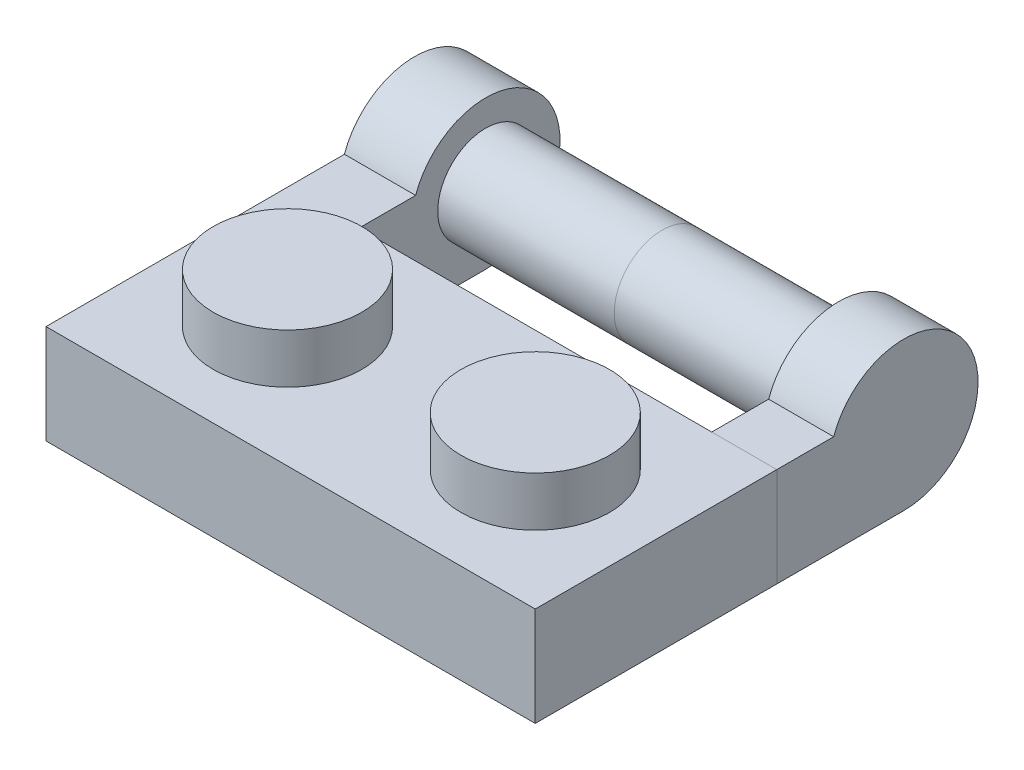
ISO-10303-21;
HEADER;
FILE_DESCRIPTION(('STEP AP214'),'2;1');
FILE_NAME('part.step','',(''),(''),'','','');
FILE_SCHEMA(('AUTOMOTIVE_DESIGN { 1 0 10303 214 1 1 1 1 }'));
ENDSEC;
DATA;
#1=APPLICATION_CONTEXT('core data for automotive mechanical design processes');
#2=APPLICATION_PROTOCOL_DEFINITION('international standard','automotive_design',2000,#1);
#3=PRODUCT_CONTEXT('',#1,'mechanical');
#4=PRODUCT('Part','Part','',(#3));
#5=PRODUCT_RELATED_PRODUCT_CATEGORY('part','',(#4));
#6=PRODUCT_DEFINITION_FORMATION('','',#4);
#7=PRODUCT_DEFINITION_CONTEXT('part definition',#1,'design');
#8=PRODUCT_DEFINITION('design','',#6,#7);
#9=PRODUCT_DEFINITION_SHAPE('','',#8);
#10=(LENGTH_UNIT() NAMED_UNIT(*) SI_UNIT(.MILLI.,.METRE.));
#11=(NAMED_UNIT(*) PLANE_ANGLE_UNIT() SI_UNIT($,.RADIAN.));
#12=(NAMED_UNIT(*) SI_UNIT($,.STERADIAN.) SOLID_ANGLE_UNIT());
#13=UNCERTAINTY_MEASURE_WITH_UNIT(LENGTH_MEASURE(1.E-05),#10,'distance_accuracy_value','');
#14=(GEOMETRIC_REPRESENTATION_CONTEXT(3) GLOBAL_UNCERTAINTY_ASSIGNED_CONTEXT((#13)) GLOBAL_UNIT_ASSIGNED_CONTEXT((#10,
#11,#12)) REPRESENTATION_CONTEXT('',''));
#15=CARTESIAN_POINT('',(0.,0.,0.));
#16=DIRECTION('',(0.,0.,1.));
#17=DIRECTION('',(1.,0.,0.));
#18=AXIS2_PLACEMENT_3D('',#15,#16,#17);
#19=CARTESIAN_POINT('',(13.7,0.,-7.8));
#20=DIRECTION('',(0.,0.,1.));
#21=DIRECTION('',(1.,0.,0.));
#22=AXIS2_PLACEMENT_3D('',#19,#20,#21);
#23=PLANE('',#22);
#24=DIRECTION('',(0.,-1.,0.));
#25=VECTOR('',#24,1.);
#26=CARTESIAN_POINT('',(15.8,0.,-7.8));
#27=LINE('',#26,#25);
#28=CARTESIAN_POINT('',(15.8,3.2,-7.8));
#29=VERTEX_POINT('',#28);
#30=CARTESIAN_POINT('',(15.8,0.,-7.8));
#31=VERTEX_POINT('',#30);
#32=EDGE_CURVE('E114',#29,#31,#27,.T.);
#33=ORIENTED_EDGE('',*,*,#32,.F.);
#34=DIRECTION('',(1.,0.,0.));
#35=VECTOR('',#34,1.);
#36=CARTESIAN_POINT('',(13.7,3.2,-7.8));
#37=LINE('',#36,#35);
#38=CARTESIAN_POINT('',(13.7,3.2,-7.8));
#39=VERTEX_POINT('',#38);
#40=EDGE_CURVE('E55',#39,#29,#37,.T.);
#41=ORIENTED_EDGE('',*,*,#40,.F.);
#42=DIRECTION('',(0.,-1.,0.));
#43=VECTOR('',#42,1.);
#44=CARTESIAN_POINT('',(13.7,0.,-7.8));
#45=LINE('',#44,#43);
#46=CARTESIAN_POINT('',(13.7,0.,-7.8));
#47=VERTEX_POINT('',#46);
#48=EDGE_CURVE('E107',#39,#47,#45,.T.);
#49=ORIENTED_EDGE('',*,*,#48,.T.);
#50=DIRECTION('',(1.,0.,0.));
#51=VECTOR('',#50,1.);
#52=CARTESIAN_POINT('',(13.7,0.,-7.8));
#53=LINE('',#52,#51);
#54=EDGE_CURVE('E90',#47,#31,#53,.T.);
#55=ORIENTED_EDGE('',*,*,#54,.T.);
#56=EDGE_LOOP('',(#33,#41,#49,#55));
#57=FACE_BOUND('',#56,.T.);
#58=ADVANCED_FACE('F47',(#57),#23,.T.);
#59=CARTESIAN_POINT('',(13.7,3.2,-7.8));
#60=DIRECTION('',(0.,1.,0.));
#61=DIRECTION('',(0.,0.,1.));
#62=AXIS2_PLACEMENT_3D('',#59,#60,#61);
#63=PLANE('',#62);
#64=DIRECTION('',(0.,0.,1.));
#65=VECTOR('',#64,1.);
#66=CARTESIAN_POINT('',(15.8,3.2,-7.8));
#67=LINE('',#66,#65);
#68=CARTESIAN_POINT('',(15.8,3.2,-9.63725830020305));
#69=VERTEX_POINT('',#68);
#70=EDGE_CURVE('E109',#69,#29,#67,.T.);
#71=ORIENTED_EDGE('',*,*,#70,.F.);
#72=DIRECTION('',(1.,0.,0.));
#73=VECTOR('',#72,1.);
#74=CARTESIAN_POINT('',(13.7,3.2,-9.63725830020305));
#75=LINE('',#74,#73);
#76=CARTESIAN_POINT('',(13.7,3.2,-9.63725830020305));
#77=VERTEX_POINT('',#76);
#78=EDGE_CURVE('E79',#77,#69,#75,.T.);
#79=ORIENTED_EDGE('',*,*,#78,.F.);
#80=DIRECTION('',(0.,0.,1.));
#81=VECTOR('',#80,1.);
#82=CARTESIAN_POINT('',(13.7,3.2,-7.8));
#83=LINE('',#82,#81);
#84=EDGE_CURVE('E104',#77,#39,#83,.T.);
#85=ORIENTED_EDGE('',*,*,#84,.T.);
#86=ORIENTED_EDGE('',*,*,#40,.T.);
#87=EDGE_LOOP('',(#71,#79,#85,#86));
#88=FACE_BOUND('',#87,.T.);
#89=ADVANCED_FACE('F126',(#88),#63,.T.);
#90=CARTESIAN_POINT('',(13.7,2.4,-11.9));
#91=DIRECTION('',(1.,0.,0.));
#92=DIRECTION('',(0.,0.,-1.));
#93=AXIS2_PLACEMENT_3D('',#90,#91,#92);
#94=CYLINDRICAL_SURFACE('',#93,2.4);
#95=CARTESIAN_POINT('',(15.8,2.4,-11.9));
#96=DIRECTION('',(1.,0.,0.));
#97=DIRECTION('',(0.,0.,-1.));
#98=AXIS2_PLACEMENT_3D('',#95,#96,#97);
#99=CIRCLE('',#98,2.4);
#100=CARTESIAN_POINT('',(15.8,0.,-11.9));
#101=VERTEX_POINT('',#100);
#102=EDGE_CURVE('E98',#101,#69,#99,.T.);
#103=ORIENTED_EDGE('',*,*,#102,.F.);
#104=DIRECTION('',(1.,0.,0.));
#105=VECTOR('',#104,1.);
#106=CARTESIAN_POINT('',(13.7,0.,-11.9));
#107=LINE('',#106,#105);
#108=CARTESIAN_POINT('',(13.7,0.,-11.9));
#109=VERTEX_POINT('',#108);
#110=EDGE_CURVE('E93',#109,#101,#107,.T.);
#111=ORIENTED_EDGE('',*,*,#110,.F.);
#112=CARTESIAN_POINT('',(13.7,2.4,-11.9));
#113=DIRECTION('',(1.,0.,0.));
#114=DIRECTION('',(0.,0.,-1.));
#115=AXIS2_PLACEMENT_3D('',#112,#113,#114);
#116=CIRCLE('',#115,2.4);
#117=EDGE_CURVE('E96',#109,#77,#116,.T.);
#118=ORIENTED_EDGE('',*,*,#117,.T.);
#119=ORIENTED_EDGE('',*,*,#78,.T.);
#120=EDGE_LOOP('',(#103,#111,#118,#119));
#121=FACE_BOUND('',#120,.T.);
#122=ADVANCED_FACE('F95',(#121),#94,.T.);
#123=CARTESIAN_POINT('',(13.7,0.,-11.9));
#124=DIRECTION('',(0.,-1.,0.));
#125=DIRECTION('',(0.,0.,-1.));
#126=AXIS2_PLACEMENT_3D('',#123,#124,#125);
#127=PLANE('',#126);
#128=DIRECTION('',(0.,0.,-1.));
#129=VECTOR('',#128,1.);
#130=CARTESIAN_POINT('',(15.8,0.,-11.9));
#131=LINE('',#130,#129);
#132=EDGE_CURVE('E117',#31,#101,#131,.T.);
#133=ORIENTED_EDGE('',*,*,#132,.F.);
#134=ORIENTED_EDGE('',*,*,#54,.F.);
#135=DIRECTION('',(0.,0.,-1.));
#136=VECTOR('',#135,1.);
#137=CARTESIAN_POINT('',(13.7,0.,-11.9));
#138=LINE('',#137,#136);
#139=EDGE_CURVE('E103',#47,#109,#138,.T.);
#140=ORIENTED_EDGE('',*,*,#139,.T.);
#141=ORIENTED_EDGE('',*,*,#110,.T.);
#142=EDGE_LOOP('',(#133,#134,#140,#141));
#143=FACE_BOUND('',#142,.T.);
#144=ADVANCED_FACE('F106',(#143),#127,.T.);
#145=CARTESIAN_POINT('',(13.7,2.4,-11.9));
#146=DIRECTION('',(1.,0.,0.));
#147=DIRECTION('',(0.,0.,-1.));
#148=AXIS2_PLACEMENT_3D('',#145,#146,#147);
#149=PLANE('',#148);
#150=CARTESIAN_POINT('',(13.7,2.4,-11.9));
#151=DIRECTION('',(1.,0.,0.));
#152=DIRECTION('',(0.,0.,-1.));
#153=AXIS2_PLACEMENT_3D('',#150,#151,#152);
#154=CIRCLE('',#153,1.55);
#155=CARTESIAN_POINT('',(13.7,2.4,-13.45));
#156=VERTEX_POINT('',#155);
#157=EDGE_CURVE('E12',#156,#156,#154,.F.);
#158=ORIENTED_EDGE('',*,*,#157,.F.);
#159=EDGE_LOOP('',(#158));
#160=FACE_BOUND('',#159,.T.);
#161=ORIENTED_EDGE('',*,*,#48,.F.);
#162=ORIENTED_EDGE('',*,*,#84,.F.);
#163=ORIENTED_EDGE('',*,*,#117,.F.);
#164=ORIENTED_EDGE('',*,*,#139,.F.);
#165=EDGE_LOOP('',(#161,#162,#163,#164));
#166=FACE_BOUND('',#165,.T.);
#167=ADVANCED_FACE('F102',(#160,#166),#149,.F.);
#168=CARTESIAN_POINT('',(15.8,2.4,-11.9));
#169=DIRECTION('',(1.,0.,0.));
#170=DIRECTION('',(0.,0.,-1.));
#171=AXIS2_PLACEMENT_3D('',#168,#169,#170);
#172=PLANE('',#171);
#173=ORIENTED_EDGE('',*,*,#32,.T.);
#174=ORIENTED_EDGE('',*,*,#132,.T.);
#175=ORIENTED_EDGE('',*,*,#102,.T.);
#176=ORIENTED_EDGE('',*,*,#70,.T.);
#177=EDGE_LOOP('',(#173,#174,#175,#176));
#178=FACE_BOUND('',#177,.T.);
#179=ADVANCED_FACE('F125',(#178),#172,.T.);
#180=CARTESIAN_POINT('',(3.61593795664341,2.4,-11.9));
#181=DIRECTION('',(1.,0.,0.));
#182=DIRECTION('',(0.,0.,-1.));
#183=AXIS2_PLACEMENT_3D('',#180,#181,#182);
#184=CYLINDRICAL_SURFACE('',#183,1.55);
#185=CARTESIAN_POINT('',(8.,2.4,-11.9));
#186=DIRECTION('',(1.,0.,0.));
#187=DIRECTION('',(0.,0.,-1.));
#188=AXIS2_PLACEMENT_3D('',#185,#186,#187);
#189=CIRCLE('',#188,1.55);
#190=CARTESIAN_POINT('',(8.,2.4,-13.45));
#191=VERTEX_POINT('',#190);
#192=EDGE_CURVE('E118',#191,#191,#189,.T.);
#193=ORIENTED_EDGE('',*,*,#192,.T.);
#194=EDGE_LOOP('',(#193));
#195=FACE_BOUND('',#194,.T.);
#196=ORIENTED_EDGE('',*,*,#157,.T.);
#197=EDGE_LOOP('',(#196));
#198=FACE_BOUND('',#197,.T.);
#199=ADVANCED_FACE('F144',(#195,#198),#184,.T.);
#200=CARTESIAN_POINT('',(8.,0.,0.));
#201=DIRECTION('',(1.,0.,0.));
#202=DIRECTION('',(0.,0.,-1.));
#203=AXIS2_PLACEMENT_3D('',#200,#201,#202);
#204=PLANE('',#203);
#205=ORIENTED_EDGE('',*,*,#192,.F.);
#206=EDGE_LOOP('',(#205));
#207=FACE_BOUND('',#206,.T.);
#208=ADVANCED_FACE('F149',(#207),#204,.F.);
#209=CLOSED_SHELL('',(#58,#89,#122,#144,#167,#179,#199,#208));
#210=MANIFOLD_SOLID_BREP('B2',#209);
#211=CARTESIAN_POINT('',(0.,0.,-7.8));
#212=DIRECTION('',(0.,0.,-1.));
#213=DIRECTION('',(-1.,0.,0.));
#214=AXIS2_PLACEMENT_3D('',#211,#212,#213);
#215=PLANE('',#214);
#216=DIRECTION('',(1.,0.,0.));
#217=VECTOR('',#216,1.);
#218=CARTESIAN_POINT('',(0.,0.,-7.8));
#219=LINE('',#218,#217);
#220=CARTESIAN_POINT('',(2.3,0.,-7.8));
#221=VERTEX_POINT('',#220);
#222=CARTESIAN_POINT('',(15.8,0.,-7.8));
#223=VERTEX_POINT('',#222);
#224=EDGE_CURVE('E269',#221,#223,#219,.T.);
#225=ORIENTED_EDGE('',*,*,#224,.F.);
#226=DIRECTION('',(0.,-1.,0.));
#227=VECTOR('',#226,1.);
#228=CARTESIAN_POINT('',(2.3,0.,-7.8));
#229=LINE('',#228,#227);
#230=CARTESIAN_POINT('',(2.3,3.2,-7.8));
#231=VERTEX_POINT('',#230);
#232=EDGE_CURVE('E298',#231,#221,#229,.T.);
#233=ORIENTED_EDGE('',*,*,#232,.F.);
#234=DIRECTION('',(-1.,0.,0.));
#235=VECTOR('',#234,1.);
#236=CARTESIAN_POINT('',(0.,3.2,-7.8));
#237=LINE('',#236,#235);
#238=CARTESIAN_POINT('',(15.8,3.2,-7.8));
#239=VERTEX_POINT('',#238);
#240=EDGE_CURVE('E278',#239,#231,#237,.T.);
#241=ORIENTED_EDGE('',*,*,#240,.F.);
#242=DIRECTION('',(0.,1.,0.));
#243=VECTOR('',#242,1.);
#244=CARTESIAN_POINT('',(15.8,0.,-7.8));
#245=LINE('',#244,#243);
#246=EDGE_CURVE('E271',#223,#239,#245,.T.);
#247=ORIENTED_EDGE('',*,*,#246,.F.);
#248=EDGE_LOOP('',(#225,#233,#241,#247));
#249=FACE_BOUND('',#248,.T.);
#250=ADVANCED_FACE('F201',(#249),#215,.T.);
#251=CARTESIAN_POINT('',(0.,0.,-7.8));
#252=DIRECTION('',(0.,-1.,0.));
#253=DIRECTION('',(0.,0.,-1.));
#254=AXIS2_PLACEMENT_3D('',#251,#252,#253);
#255=PLANE('',#254);
#256=DIRECTION('',(0.,0.,-1.));
#257=VECTOR('',#256,1.);
#258=CARTESIAN_POINT('',(2.3,0.,-11.9));
#259=LINE('',#258,#257);
#260=CARTESIAN_POINT('',(2.3,0.,-11.9));
#261=VERTEX_POINT('',#260);
#262=EDGE_CURVE('E305',#221,#261,#259,.T.);
#263=ORIENTED_EDGE('',*,*,#262,.F.);
#264=ORIENTED_EDGE('',*,*,#224,.T.);
#265=DIRECTION('',(0.,0.,1.));
#266=VECTOR('',#265,1.);
#267=CARTESIAN_POINT('',(15.8,0.,-7.8));
#268=LINE('',#267,#266);
#269=CARTESIAN_POINT('',(15.8,0.,0.));
#270=VERTEX_POINT('',#269);
#271=EDGE_CURVE('E277',#223,#270,#268,.T.);
#272=ORIENTED_EDGE('',*,*,#271,.T.);
#273=DIRECTION('',(1.,0.,0.));
#274=VECTOR('',#273,1.);
#275=CARTESIAN_POINT('',(0.,0.,0.));
#276=LINE('',#275,#274);
#277=CARTESIAN_POINT('',(0.,0.,0.));
#278=VERTEX_POINT('',#277);
#279=EDGE_CURVE('E262',#278,#270,#276,.T.);
#280=ORIENTED_EDGE('',*,*,#279,.F.);
#281=DIRECTION('',(0.,0.,1.));
#282=VECTOR('',#281,1.);
#283=CARTESIAN_POINT('',(0.,0.,-7.8));
#284=LINE('',#283,#282);
#285=CARTESIAN_POINT('',(0.,0.,-11.9));
#286=VERTEX_POINT('',#285);
#287=EDGE_CURVE('E258',#286,#278,#284,.T.);
#288=ORIENTED_EDGE('',*,*,#287,.F.);
#289=DIRECTION('',(1.,0.,0.));
#290=VECTOR('',#289,1.);
#291=CARTESIAN_POINT('',(-8.0802227692063,0.,-11.9));
#292=LINE('',#291,#290);
#293=EDGE_CURVE('E320',#286,#261,#292,.T.);
#294=ORIENTED_EDGE('',*,*,#293,.T.);
#295=EDGE_LOOP('',(#263,#264,#272,#280,#288,#294));
#296=FACE_BOUND('',#295,.T.);
#297=DIRECTION('',(0.,0.,1.));
#298=VECTOR('',#297,1.);
#299=CARTESIAN_POINT('',(1.2,0.,-7.8));
#300=LINE('',#299,#298);
#301=CARTESIAN_POINT('',(1.2,0.,-6.6));
#302=VERTEX_POINT('',#301);
#303=CARTESIAN_POINT('',(1.2,0.,-1.2));
#304=VERTEX_POINT('',#303);
#305=EDGE_CURVE('E363',#302,#304,#300,.T.);
#306=ORIENTED_EDGE('',*,*,#305,.T.);
#307=DIRECTION('',(1.,0.,0.));
#308=VECTOR('',#307,1.);
#309=CARTESIAN_POINT('',(0.,0.,-1.2));
#310=LINE('',#309,#308);
#311=CARTESIAN_POINT('',(14.6,0.,-1.2));
#312=VERTEX_POINT('',#311);
#313=EDGE_CURVE('E338',#304,#312,#310,.T.);
#314=ORIENTED_EDGE('',*,*,#313,.T.);
#315=DIRECTION('',(0.,0.,1.));
#316=VECTOR('',#315,1.);
#317=CARTESIAN_POINT('',(14.6,0.,-7.8));
#318=LINE('',#317,#316);
#319=CARTESIAN_POINT('',(14.6,0.,-6.6));
#320=VERTEX_POINT('',#319);
#321=EDGE_CURVE('E359',#320,#312,#318,.T.);
#322=ORIENTED_EDGE('',*,*,#321,.F.);
#323=DIRECTION('',(1.,0.,0.));
#324=VECTOR('',#323,1.);
#325=CARTESIAN_POINT('',(0.,0.,-6.6));
#326=LINE('',#325,#324);
#327=EDGE_CURVE('E216',#302,#320,#326,.T.);
#328=ORIENTED_EDGE('',*,*,#327,.F.);
#329=EDGE_LOOP('',(#306,#314,#322,#328));
#330=FACE_BOUND('',#329,.T.);
#331=ADVANCED_FACE('F285',(#296,#330),#255,.T.);
#332=CARTESIAN_POINT('',(0.,0.,-7.8));
#333=DIRECTION('',(-1.,0.,0.));
#334=DIRECTION('',(0.,0.,1.));
#335=AXIS2_PLACEMENT_3D('',#332,#333,#334);
#336=PLANE('',#335);
#337=DIRECTION('',(0.,-1.,0.));
#338=VECTOR('',#337,1.);
#339=CARTESIAN_POINT('',(0.,0.,0.));
#340=LINE('',#339,#338);
#341=CARTESIAN_POINT('',(0.,3.2,0.));
#342=VERTEX_POINT('',#341);
#343=EDGE_CURVE('E256',#342,#278,#340,.T.);
#344=ORIENTED_EDGE('',*,*,#343,.F.);
#345=DIRECTION('',(0.,0.,1.));
#346=VECTOR('',#345,1.);
#347=CARTESIAN_POINT('',(0.,3.2,-7.8));
#348=LINE('',#347,#346);
#349=CARTESIAN_POINT('',(0.,3.2,-9.63725830020305));
#350=VERTEX_POINT('',#349);
#351=EDGE_CURVE('E209',#350,#342,#348,.T.);
#352=ORIENTED_EDGE('',*,*,#351,.F.);
#353=CARTESIAN_POINT('',(0.,2.4,-11.9));
#354=DIRECTION('',(-1.,0.,0.));
#355=DIRECTION('',(0.,0.,1.));
#356=AXIS2_PLACEMENT_3D('',#353,#354,#355);
#357=CIRCLE('',#356,2.4);
#358=EDGE_CURVE('E321',#350,#286,#357,.T.);
#359=ORIENTED_EDGE('',*,*,#358,.T.);
#360=ORIENTED_EDGE('',*,*,#287,.T.);
#361=EDGE_LOOP('',(#344,#352,#359,#360));
#362=FACE_BOUND('',#361,.T.);
#363=ADVANCED_FACE('F203',(#362),#336,.T.);
#364=CARTESIAN_POINT('',(0.,3.2,-7.8));
#365=DIRECTION('',(0.,1.,0.));
#366=DIRECTION('',(0.,0.,1.));
#367=AXIS2_PLACEMENT_3D('',#364,#365,#366);
#368=PLANE('',#367);
#369=CARTESIAN_POINT('',(11.9,3.2,-3.9));
#370=DIRECTION('',(0.,1.,0.));
#371=DIRECTION('',(0.,0.,1.));
#372=AXIS2_PLACEMENT_3D('',#369,#370,#371);
#373=CIRCLE('',#372,2.4);
#374=CARTESIAN_POINT('',(11.9,3.2,-1.5));
#375=VERTEX_POINT('',#374);
#376=EDGE_CURVE('E343',#375,#375,#373,.T.);
#377=ORIENTED_EDGE('',*,*,#376,.F.);
#378=EDGE_LOOP('',(#377));
#379=FACE_BOUND('',#378,.T.);
#380=CARTESIAN_POINT('',(3.9,3.2,-3.9));
#381=DIRECTION('',(0.,1.,0.));
#382=DIRECTION('',(0.,0.,1.));
#383=AXIS2_PLACEMENT_3D('',#380,#381,#382);
#384=CIRCLE('',#383,2.4);
#385=CARTESIAN_POINT('',(3.9,3.2,-1.5));
#386=VERTEX_POINT('',#385);
#387=EDGE_CURVE('E384',#386,#386,#384,.T.);
#388=ORIENTED_EDGE('',*,*,#387,.F.);
#389=EDGE_LOOP('',(#388));
#390=FACE_BOUND('',#389,.T.);
#391=DIRECTION('',(-1.,0.,0.));
#392=VECTOR('',#391,1.);
#393=CARTESIAN_POINT('',(0.,3.2,0.));
#394=LINE('',#393,#392);
#395=CARTESIAN_POINT('',(15.8,3.2,0.));
#396=VERTEX_POINT('',#395);
#397=EDGE_CURVE('E246',#396,#342,#394,.T.);
#398=ORIENTED_EDGE('',*,*,#397,.F.);
#399=DIRECTION('',(0.,0.,1.));
#400=VECTOR('',#399,1.);
#401=CARTESIAN_POINT('',(15.8,3.2,-7.8));
#402=LINE('',#401,#400);
#403=EDGE_CURVE('E225',#239,#396,#402,.T.);
#404=ORIENTED_EDGE('',*,*,#403,.F.);
#405=ORIENTED_EDGE('',*,*,#240,.T.);
#406=DIRECTION('',(0.,0.,1.));
#407=VECTOR('',#406,1.);
#408=CARTESIAN_POINT('',(2.3,3.2,-7.8));
#409=LINE('',#408,#407);
#410=CARTESIAN_POINT('',(2.3,3.2,-9.63725830020305));
#411=VERTEX_POINT('',#410);
#412=EDGE_CURVE('E315',#411,#231,#409,.T.);
#413=ORIENTED_EDGE('',*,*,#412,.F.);
#414=DIRECTION('',(1.,0.,0.));
#415=VECTOR('',#414,1.);
#416=CARTESIAN_POINT('',(-8.0802227692063,3.2,-9.63725830020305));
#417=LINE('',#416,#415);
#418=EDGE_CURVE('E250',#350,#411,#417,.T.);
#419=ORIENTED_EDGE('',*,*,#418,.F.);
#420=ORIENTED_EDGE('',*,*,#351,.T.);
#421=EDGE_LOOP('',(#398,#404,#405,#413,#419,#420));
#422=FACE_BOUND('',#421,.T.);
#423=ADVANCED_FACE('F244',(#379,#390,#422),#368,.T.);
#424=CARTESIAN_POINT('',(15.8,0.,-7.8));
#425=DIRECTION('',(1.,0.,0.));
#426=DIRECTION('',(0.,0.,-1.));
#427=AXIS2_PLACEMENT_3D('',#424,#425,#426);
#428=PLANE('',#427);
#429=DIRECTION('',(0.,1.,0.));
#430=VECTOR('',#429,1.);
#431=CARTESIAN_POINT('',(15.8,0.,0.));
#432=LINE('',#431,#430);
#433=EDGE_CURVE('E268',#270,#396,#432,.T.);
#434=ORIENTED_EDGE('',*,*,#433,.F.);
#435=ORIENTED_EDGE('',*,*,#271,.F.);
#436=ORIENTED_EDGE('',*,*,#246,.T.);
#437=ORIENTED_EDGE('',*,*,#403,.T.);
#438=EDGE_LOOP('',(#434,#435,#436,#437));
#439=FACE_BOUND('',#438,.T.);
#440=ADVANCED_FACE('F294',(#439),#428,.T.);
#441=CARTESIAN_POINT('',(0.,0.,0.));
#442=DIRECTION('',(0.,0.,-1.));
#443=DIRECTION('',(-1.,0.,0.));
#444=AXIS2_PLACEMENT_3D('',#441,#442,#443);
#445=PLANE('',#444);
#446=ORIENTED_EDGE('',*,*,#343,.T.);
#447=ORIENTED_EDGE('',*,*,#279,.T.);
#448=ORIENTED_EDGE('',*,*,#433,.T.);
#449=ORIENTED_EDGE('',*,*,#397,.T.);
#450=EDGE_LOOP('',(#446,#447,#448,#449));
#451=FACE_BOUND('',#450,.T.);
#452=ADVANCED_FACE('F266',(#451),#445,.F.);
#453=CARTESIAN_POINT('',(3.9,4.8,-3.9));
#454=DIRECTION('',(0.,-1.,0.));
#455=DIRECTION('',(0.,0.,-1.));
#456=AXIS2_PLACEMENT_3D('',#453,#454,#455);
#457=CYLINDRICAL_SURFACE('',#456,2.4);
#458=CARTESIAN_POINT('',(3.9,4.8,-3.9));
#459=DIRECTION('',(0.,1.,0.));
#460=DIRECTION('',(0.,0.,1.));
#461=AXIS2_PLACEMENT_3D('',#458,#459,#460);
#462=CIRCLE('',#461,2.4);
#463=CARTESIAN_POINT('',(3.9,4.8,-1.5));
#464=VERTEX_POINT('',#463);
#465=EDGE_CURVE('E263',#464,#464,#462,.T.);
#466=ORIENTED_EDGE('',*,*,#465,.F.);
#467=EDGE_LOOP('',(#466));
#468=FACE_BOUND('',#467,.T.);
#469=ORIENTED_EDGE('',*,*,#387,.T.);
#470=EDGE_LOOP('',(#469));
#471=FACE_BOUND('',#470,.T.);
#472=ADVANCED_FACE('F390',(#468,#471),#457,.T.);
#473=CARTESIAN_POINT('',(3.9,4.8,-3.9));
#474=DIRECTION('',(0.,1.,0.));
#475=DIRECTION('',(0.,0.,1.));
#476=AXIS2_PLACEMENT_3D('',#473,#474,#475);
#477=PLANE('',#476);
#478=ORIENTED_EDGE('',*,*,#465,.T.);
#479=EDGE_LOOP('',(#478));
#480=FACE_BOUND('',#479,.T.);
#481=ADVANCED_FACE('F413',(#480),#477,.T.);
#482=CARTESIAN_POINT('',(11.9,4.8,-3.9));
#483=DIRECTION('',(0.,-1.,0.));
#484=DIRECTION('',(0.,0.,-1.));
#485=AXIS2_PLACEMENT_3D('',#482,#483,#484);
#486=CYLINDRICAL_SURFACE('',#485,2.4);
#487=CARTESIAN_POINT('',(11.9,4.8,-3.9));
#488=DIRECTION('',(0.,1.,0.));
#489=DIRECTION('',(0.,0.,1.));
#490=AXIS2_PLACEMENT_3D('',#487,#488,#489);
#491=CIRCLE('',#490,2.4);
#492=CARTESIAN_POINT('',(11.9,4.8,-1.5));
#493=VERTEX_POINT('',#492);
#494=EDGE_CURVE('E381',#493,#493,#491,.T.);
#495=ORIENTED_EDGE('',*,*,#494,.F.);
#496=EDGE_LOOP('',(#495));
#497=FACE_BOUND('',#496,.T.);
#498=ORIENTED_EDGE('',*,*,#376,.T.);
#499=EDGE_LOOP('',(#498));
#500=FACE_BOUND('',#499,.T.);
#501=ADVANCED_FACE('F418',(#497,#500),#486,.T.);
#502=CARTESIAN_POINT('',(11.9,4.8,-3.9));
#503=DIRECTION('',(0.,1.,0.));
#504=DIRECTION('',(0.,0.,1.));
#505=AXIS2_PLACEMENT_3D('',#502,#503,#504);
#506=PLANE('',#505);
#507=ORIENTED_EDGE('',*,*,#494,.T.);
#508=EDGE_LOOP('',(#507));
#509=FACE_BOUND('',#508,.T.);
#510=ADVANCED_FACE('F424',(#509),#506,.T.);
#511=CARTESIAN_POINT('',(1.2,0.,-7.8));
#512=DIRECTION('',(-1.,0.,0.));
#513=DIRECTION('',(0.,0.,1.));
#514=AXIS2_PLACEMENT_3D('',#511,#512,#513);
#515=PLANE('',#514);
#516=DIRECTION('',(0.,-1.,0.));
#517=VECTOR('',#516,1.);
#518=CARTESIAN_POINT('',(1.2,0.,-1.2));
#519=LINE('',#518,#517);
#520=CARTESIAN_POINT('',(1.2,2.,-1.2));
#521=VERTEX_POINT('',#520);
#522=EDGE_CURVE('E335',#521,#304,#519,.T.);
#523=ORIENTED_EDGE('',*,*,#522,.T.);
#524=ORIENTED_EDGE('',*,*,#305,.F.);
#525=DIRECTION('',(0.,-1.,0.));
#526=VECTOR('',#525,1.);
#527=CARTESIAN_POINT('',(1.2,0.,-6.6));
#528=LINE('',#527,#526);
#529=CARTESIAN_POINT('',(1.2,2.,-6.6));
#530=VERTEX_POINT('',#529);
#531=EDGE_CURVE('E345',#530,#302,#528,.T.);
#532=ORIENTED_EDGE('',*,*,#531,.F.);
#533=DIRECTION('',(0.,0.,1.));
#534=VECTOR('',#533,1.);
#535=CARTESIAN_POINT('',(1.2,2.,-7.8));
#536=LINE('',#535,#534);
#537=EDGE_CURVE('E340',#530,#521,#536,.T.);
#538=ORIENTED_EDGE('',*,*,#537,.T.);
#539=EDGE_LOOP('',(#523,#524,#532,#538));
#540=FACE_BOUND('',#539,.T.);
#541=ADVANCED_FACE('F430',(#540),#515,.F.);
#542=CARTESIAN_POINT('',(0.,2.,-7.8));
#543=DIRECTION('',(0.,1.,0.));
#544=DIRECTION('',(0.,0.,1.));
#545=AXIS2_PLACEMENT_3D('',#542,#543,#544);
#546=PLANE('',#545);
#547=CARTESIAN_POINT('',(7.9,2.,-3.9));
#548=DIRECTION('',(0.,1.,0.));
#549=DIRECTION('',(0.,0.,1.));
#550=AXIS2_PLACEMENT_3D('',#547,#548,#549);
#551=CIRCLE('',#550,1.5);
#552=CARTESIAN_POINT('',(7.9,2.,-2.4));
#553=VERTEX_POINT('',#552);
#554=EDGE_CURVE('E45',#553,#553,#551,.F.);
#555=ORIENTED_EDGE('',*,*,#554,.F.);
#556=EDGE_LOOP('',(#555));
#557=FACE_BOUND('',#556,.T.);
#558=CARTESIAN_POINT('',(11.9,2.,-3.9));
#559=DIRECTION('',(0.,1.,0.));
#560=DIRECTION('',(0.,0.,1.));
#561=AXIS2_PLACEMENT_3D('',#558,#559,#560);
#562=CIRCLE('',#561,1.2);
#563=CARTESIAN_POINT('',(11.9,2.,-2.7));
#564=VERTEX_POINT('',#563);
#565=EDGE_CURVE('E329',#564,#564,#562,.T.);
#566=ORIENTED_EDGE('',*,*,#565,.T.);
#567=EDGE_LOOP('',(#566));
#568=FACE_BOUND('',#567,.T.);
#569=CARTESIAN_POINT('',(3.9,2.,-3.9));
#570=DIRECTION('',(0.,1.,0.));
#571=DIRECTION('',(0.,0.,1.));
#572=AXIS2_PLACEMENT_3D('',#569,#570,#571);
#573=CIRCLE('',#572,1.2);
#574=CARTESIAN_POINT('',(3.9,2.,-2.7));
#575=VERTEX_POINT('',#574);
#576=EDGE_CURVE('E351',#575,#575,#573,.T.);
#577=ORIENTED_EDGE('',*,*,#576,.T.);
#578=EDGE_LOOP('',(#577));
#579=FACE_BOUND('',#578,.T.);
#580=DIRECTION('',(-1.,0.,0.));
#581=VECTOR('',#580,1.);
#582=CARTESIAN_POINT('',(0.,2.,-1.2));
#583=LINE('',#582,#581);
#584=CARTESIAN_POINT('',(14.6,2.,-1.2));
#585=VERTEX_POINT('',#584);
#586=EDGE_CURVE('E347',#585,#521,#583,.T.);
#587=ORIENTED_EDGE('',*,*,#586,.T.);
#588=ORIENTED_EDGE('',*,*,#537,.F.);
#589=DIRECTION('',(-1.,0.,0.));
#590=VECTOR('',#589,1.);
#591=CARTESIAN_POINT('',(0.,2.,-6.6));
#592=LINE('',#591,#590);
#593=CARTESIAN_POINT('',(14.6,2.,-6.6));
#594=VERTEX_POINT('',#593);
#595=EDGE_CURVE('E360',#594,#530,#592,.T.);
#596=ORIENTED_EDGE('',*,*,#595,.F.);
#597=DIRECTION('',(0.,0.,1.));
#598=VECTOR('',#597,1.);
#599=CARTESIAN_POINT('',(14.6,2.,-7.8));
#600=LINE('',#599,#598);
#601=EDGE_CURVE('E344',#594,#585,#600,.T.);
#602=ORIENTED_EDGE('',*,*,#601,.T.);
#603=EDGE_LOOP('',(#587,#588,#596,#602));
#604=FACE_BOUND('',#603,.T.);
#605=ADVANCED_FACE('F459',(#557,#568,#579,#604),#546,.F.);
#606=CARTESIAN_POINT('',(14.6,0.,-7.8));
#607=DIRECTION('',(1.,0.,0.));
#608=DIRECTION('',(0.,0.,-1.));
#609=AXIS2_PLACEMENT_3D('',#606,#607,#608);
#610=PLANE('',#609);
#611=DIRECTION('',(0.,1.,0.));
#612=VECTOR('',#611,1.);
#613=CARTESIAN_POINT('',(14.6,0.,-1.2));
#614=LINE('',#613,#612);
#615=EDGE_CURVE('E356',#312,#585,#614,.T.);
#616=ORIENTED_EDGE('',*,*,#615,.T.);
#617=ORIENTED_EDGE('',*,*,#601,.F.);
#618=DIRECTION('',(0.,1.,0.));
#619=VECTOR('',#618,1.);
#620=CARTESIAN_POINT('',(14.6,0.,-6.6));
#621=LINE('',#620,#619);
#622=EDGE_CURVE('E364',#320,#594,#621,.T.);
#623=ORIENTED_EDGE('',*,*,#622,.F.);
#624=ORIENTED_EDGE('',*,*,#321,.T.);
#625=EDGE_LOOP('',(#616,#617,#623,#624));
#626=FACE_BOUND('',#625,.T.);
#627=ADVANCED_FACE('F456',(#626),#610,.F.);
#628=CARTESIAN_POINT('',(0.,0.,-6.6));
#629=DIRECTION('',(0.,0.,-1.));
#630=DIRECTION('',(-1.,0.,0.));
#631=AXIS2_PLACEMENT_3D('',#628,#629,#630);
#632=PLANE('',#631);
#633=ORIENTED_EDGE('',*,*,#531,.T.);
#634=ORIENTED_EDGE('',*,*,#327,.T.);
#635=ORIENTED_EDGE('',*,*,#622,.T.);
#636=ORIENTED_EDGE('',*,*,#595,.T.);
#637=EDGE_LOOP('',(#633,#634,#635,#636));
#638=FACE_BOUND('',#637,.T.);
#639=ADVANCED_FACE('F452',(#638),#632,.F.);
#640=CARTESIAN_POINT('',(0.,0.,-1.2));
#641=DIRECTION('',(0.,0.,-1.));
#642=DIRECTION('',(-1.,0.,0.));
#643=AXIS2_PLACEMENT_3D('',#640,#641,#642);
#644=PLANE('',#643);
#645=ORIENTED_EDGE('',*,*,#522,.F.);
#646=ORIENTED_EDGE('',*,*,#586,.F.);
#647=ORIENTED_EDGE('',*,*,#615,.F.);
#648=ORIENTED_EDGE('',*,*,#313,.F.);
#649=EDGE_LOOP('',(#645,#646,#647,#648));
#650=FACE_BOUND('',#649,.T.);
#651=ADVANCED_FACE('F448',(#650),#644,.T.);
#652=CARTESIAN_POINT('',(3.9,4.8,-3.9));
#653=DIRECTION('',(0.,-1.,0.));
#654=DIRECTION('',(0.,0.,-1.));
#655=AXIS2_PLACEMENT_3D('',#652,#653,#654);
#656=CYLINDRICAL_SURFACE('',#655,1.2);
#657=CARTESIAN_POINT('',(3.9,3.6,-3.9));
#658=DIRECTION('',(0.,1.,0.));
#659=DIRECTION('',(0.,0.,1.));
#660=AXIS2_PLACEMENT_3D('',#657,#658,#659);
#661=CIRCLE('',#660,1.2);
#662=CARTESIAN_POINT('',(3.9,3.6,-2.7));
#663=VERTEX_POINT('',#662);
#664=EDGE_CURVE('E339',#663,#663,#661,.T.);
#665=ORIENTED_EDGE('',*,*,#664,.T.);
#666=EDGE_LOOP('',(#665));
#667=FACE_BOUND('',#666,.T.);
#668=ORIENTED_EDGE('',*,*,#576,.F.);
#669=EDGE_LOOP('',(#668));
#670=FACE_BOUND('',#669,.T.);
#671=ADVANCED_FACE('F444',(#667,#670),#656,.F.);
#672=CARTESIAN_POINT('',(3.9,3.6,-3.9));
#673=DIRECTION('',(0.,1.,0.));
#674=DIRECTION('',(0.,0.,1.));
#675=AXIS2_PLACEMENT_3D('',#672,#673,#674);
#676=PLANE('',#675);
#677=ORIENTED_EDGE('',*,*,#664,.F.);
#678=EDGE_LOOP('',(#677));
#679=FACE_BOUND('',#678,.T.);
#680=ADVANCED_FACE('F440',(#679),#676,.F.);
#681=CARTESIAN_POINT('',(11.9,4.8,-3.9));
#682=DIRECTION('',(0.,-1.,0.));
#683=DIRECTION('',(0.,0.,-1.));
#684=AXIS2_PLACEMENT_3D('',#681,#682,#683);
#685=CYLINDRICAL_SURFACE('',#684,1.2);
#686=CARTESIAN_POINT('',(11.9,3.6,-3.9));
#687=DIRECTION('',(0.,1.,0.));
#688=DIRECTION('',(0.,0.,1.));
#689=AXIS2_PLACEMENT_3D('',#686,#687,#688);
#690=CIRCLE('',#689,1.2);
#691=CARTESIAN_POINT('',(11.9,3.6,-2.7));
#692=VERTEX_POINT('',#691);
#693=EDGE_CURVE('E350',#692,#692,#690,.T.);
#694=ORIENTED_EDGE('',*,*,#693,.T.);
#695=EDGE_LOOP('',(#694));
#696=FACE_BOUND('',#695,.T.);
#697=ORIENTED_EDGE('',*,*,#565,.F.);
#698=EDGE_LOOP('',(#697));
#699=FACE_BOUND('',#698,.T.);
#700=ADVANCED_FACE('F436',(#696,#699),#685,.F.);
#701=CARTESIAN_POINT('',(11.9,3.6,-3.9));
#702=DIRECTION('',(0.,1.,0.));
#703=DIRECTION('',(0.,0.,1.));
#704=AXIS2_PLACEMENT_3D('',#701,#702,#703);
#705=PLANE('',#704);
#706=ORIENTED_EDGE('',*,*,#693,.F.);
#707=EDGE_LOOP('',(#706));
#708=FACE_BOUND('',#707,.T.);
#709=ADVANCED_FACE('F432',(#708),#705,.F.);
#710=CARTESIAN_POINT('',(7.9,-4.24264068711929,-3.9));
#711=DIRECTION('',(0.,1.,0.));
#712=DIRECTION('',(0.,0.,1.));
#713=AXIS2_PLACEMENT_3D('',#710,#711,#712);
#714=CYLINDRICAL_SURFACE('',#713,1.5);
#715=ORIENTED_EDGE('',*,*,#554,.T.);
#716=EDGE_LOOP('',(#715));
#717=FACE_BOUND('',#716,.T.);
#718=CARTESIAN_POINT('',(7.9,0.2,-3.9));
#719=DIRECTION('',(0.,-1.,0.));
#720=DIRECTION('',(0.,0.,-1.));
#721=AXIS2_PLACEMENT_3D('',#718,#719,#720);
#722=CIRCLE('',#721,1.5);
#723=CARTESIAN_POINT('',(7.9,0.2,-5.4));
#724=VERTEX_POINT('',#723);
#725=EDGE_CURVE('E326',#724,#724,#722,.T.);
#726=ORIENTED_EDGE('',*,*,#725,.F.);
#727=EDGE_LOOP('',(#726));
#728=FACE_BOUND('',#727,.T.);
#729=ADVANCED_FACE('F435',(#717,#728),#714,.T.);
#730=CARTESIAN_POINT('',(7.9,-4.24264068711929,-3.9));
#731=DIRECTION('',(0.,1.,0.));
#732=DIRECTION('',(0.,0.,1.));
#733=AXIS2_PLACEMENT_3D('',#730,#731,#732);
#734=CYLINDRICAL_SURFACE('',#733,0.6);
#735=CARTESIAN_POINT('',(7.9,2.,-3.9));
#736=DIRECTION('',(0.,-1.,0.));
#737=DIRECTION('',(0.,0.,-1.));
#738=AXIS2_PLACEMENT_3D('',#735,#736,#737);
#739=CIRCLE('',#738,0.6);
#740=CARTESIAN_POINT('',(7.9,2.,-4.5));
#741=VERTEX_POINT('',#740);
#742=EDGE_CURVE('E330',#741,#741,#739,.T.);
#743=ORIENTED_EDGE('',*,*,#742,.F.);
#744=EDGE_LOOP('',(#743));
#745=FACE_BOUND('',#744,.T.);
#746=CARTESIAN_POINT('',(7.9,0.2,-3.9));
#747=DIRECTION('',(0.,-1.,0.));
#748=DIRECTION('',(0.,0.,-1.));
#749=AXIS2_PLACEMENT_3D('',#746,#747,#748);
#750=CIRCLE('',#749,0.6);
#751=CARTESIAN_POINT('',(7.9,0.2,-4.5));
#752=VERTEX_POINT('',#751);
#753=EDGE_CURVE('E323',#752,#752,#750,.T.);
#754=ORIENTED_EDGE('',*,*,#753,.T.);
#755=EDGE_LOOP('',(#754));
#756=FACE_BOUND('',#755,.T.);
#757=ADVANCED_FACE('F470',(#745,#756),#734,.F.);
#758=CARTESIAN_POINT('',(0.,0.2,-7.8));
#759=DIRECTION('',(0.,-1.,0.));
#760=DIRECTION('',(0.,0.,-1.));
#761=AXIS2_PLACEMENT_3D('',#758,#759,#760);
#762=PLANE('',#761);
#763=ORIENTED_EDGE('',*,*,#753,.F.);
#764=EDGE_LOOP('',(#763));
#765=FACE_BOUND('',#764,.T.);
#766=ORIENTED_EDGE('',*,*,#725,.T.);
#767=EDGE_LOOP('',(#766));
#768=FACE_BOUND('',#767,.T.);
#769=ADVANCED_FACE('F474',(#765,#768),#762,.T.);
#770=ORIENTED_EDGE('',*,*,#742,.T.);
#771=EDGE_LOOP('',(#770));
#772=FACE_BOUND('',#771,.T.);
#773=ADVANCED_FACE('F464',(#772),#546,.F.);
#774=CARTESIAN_POINT('',(-8.0802227692063,2.4,-11.9));
#775=DIRECTION('',(1.,0.,0.));
#776=DIRECTION('',(0.,0.,-1.));
#777=AXIS2_PLACEMENT_3D('',#774,#775,#776);
#778=CYLINDRICAL_SURFACE('',#777,2.4);
#779=ORIENTED_EDGE('',*,*,#358,.F.);
#780=ORIENTED_EDGE('',*,*,#418,.T.);
#781=CARTESIAN_POINT('',(2.3,2.4,-11.9));
#782=DIRECTION('',(1.,0.,0.));
#783=DIRECTION('',(0.,0.,-1.));
#784=AXIS2_PLACEMENT_3D('',#781,#782,#783);
#785=CIRCLE('',#784,2.4);
#786=EDGE_CURVE('E308',#261,#411,#785,.T.);
#787=ORIENTED_EDGE('',*,*,#786,.F.);
#788=ORIENTED_EDGE('',*,*,#293,.F.);
#789=EDGE_LOOP('',(#779,#780,#787,#788));
#790=FACE_BOUND('',#789,.T.);
#791=ADVANCED_FACE('F479',(#790),#778,.T.);
#792=CARTESIAN_POINT('',(2.3,2.4,-11.9));
#793=DIRECTION('',(-1.,0.,0.));
#794=DIRECTION('',(0.,0.,-1.));
#795=AXIS2_PLACEMENT_3D('',#792,#793,#794);
#796=PLANE('',#795);
#797=CARTESIAN_POINT('',(2.3,2.4,-11.9));
#798=DIRECTION('',(1.,0.,0.));
#799=DIRECTION('',(0.,0.,-1.));
#800=AXIS2_PLACEMENT_3D('',#797,#798,#799);
#801=CIRCLE('',#800,1.55);
#802=CARTESIAN_POINT('',(2.3,2.4,-13.45));
#803=VERTEX_POINT('',#802);
#804=EDGE_CURVE('E317',#803,#803,#801,.F.);
#805=ORIENTED_EDGE('',*,*,#804,.T.);
#806=EDGE_LOOP('',(#805));
#807=FACE_BOUND('',#806,.T.);
#808=ORIENTED_EDGE('',*,*,#232,.T.);
#809=ORIENTED_EDGE('',*,*,#262,.T.);
#810=ORIENTED_EDGE('',*,*,#786,.T.);
#811=ORIENTED_EDGE('',*,*,#412,.T.);
#812=EDGE_LOOP('',(#808,#809,#810,#811));
#813=FACE_BOUND('',#812,.T.);
#814=ADVANCED_FACE('F482',(#807,#813),#796,.F.);
#815=CARTESIAN_POINT('',(12.3840620433566,2.4,-11.9));
#816=DIRECTION('',(-1.,0.,0.));
#817=DIRECTION('',(0.,0.,-1.));
#818=AXIS2_PLACEMENT_3D('',#815,#816,#817);
#819=CYLINDRICAL_SURFACE('',#818,1.55);
#820=CARTESIAN_POINT('',(8.,2.4,-11.9));
#821=DIRECTION('',(1.,0.,0.));
#822=DIRECTION('',(0.,0.,-1.));
#823=AXIS2_PLACEMENT_3D('',#820,#821,#822);
#824=CIRCLE('',#823,1.55);
#825=CARTESIAN_POINT('',(8.,2.4,-13.45));
#826=VERTEX_POINT('',#825);
#827=EDGE_CURVE('E306',#826,#826,#824,.T.);
#828=ORIENTED_EDGE('',*,*,#827,.F.);
#829=EDGE_LOOP('',(#828));
#830=FACE_BOUND('',#829,.T.);
#831=ORIENTED_EDGE('',*,*,#804,.F.);
#832=EDGE_LOOP('',(#831));
#833=FACE_BOUND('',#832,.T.);
#834=ADVANCED_FACE('F486',(#830,#833),#819,.T.);
#835=CARTESIAN_POINT('',(8.,0.,0.));
#836=DIRECTION('',(-1.,0.,0.));
#837=DIRECTION('',(0.,0.,-1.));
#838=AXIS2_PLACEMENT_3D('',#835,#836,#837);
#839=PLANE('',#838);
#840=ORIENTED_EDGE('',*,*,#827,.T.);
#841=EDGE_LOOP('',(#840));
#842=FACE_BOUND('',#841,.T.);
#843=ADVANCED_FACE('F490',(#842),#839,.F.);
#844=CLOSED_SHELL('',(#250,#331,#363,#423,#440,#452,#472,#481,#501,#510,#541,#605,#627,#639,
#651,#671,#680,#700,#709,#729,#757,#769,#773,#791,#814,#834,#843));
#845=MANIFOLD_SOLID_BREP('B6',#844);
#846=ADVANCED_BREP_SHAPE_REPRESENTATION('',(#18,#210,#845),#14);
#847=SHAPE_DEFINITION_REPRESENTATION(#9,#846);
ENDSEC;
END-ISO-10303-21;
